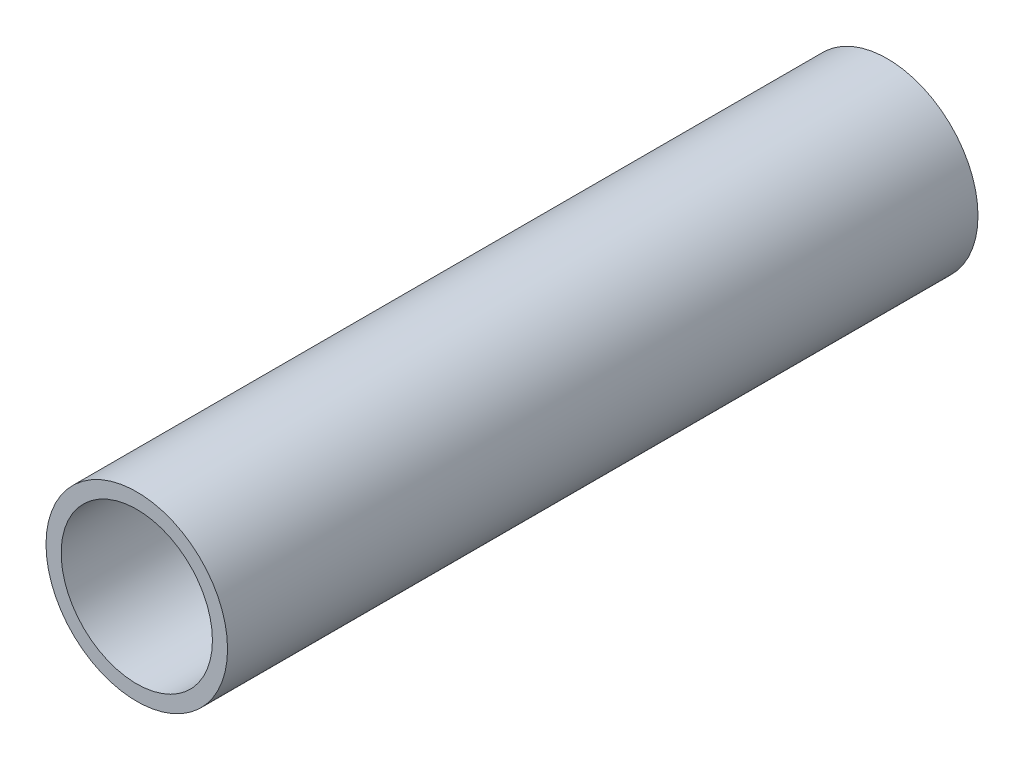
ISO-10303-21;
HEADER;
FILE_DESCRIPTION(('STEP AP214'),'2;1');
FILE_NAME('part.step','',(''),(''),'','','');
FILE_SCHEMA(('AUTOMOTIVE_DESIGN { 1 0 10303 214 1 1 1 1 }'));
ENDSEC;
DATA;
#1=APPLICATION_CONTEXT('core data for automotive mechanical design processes');
#2=APPLICATION_PROTOCOL_DEFINITION('international standard','automotive_design',2000,#1);
#3=PRODUCT_CONTEXT('',#1,'mechanical');
#4=PRODUCT('Part','Part','',(#3));
#5=PRODUCT_RELATED_PRODUCT_CATEGORY('part','',(#4));
#6=PRODUCT_DEFINITION_FORMATION('','',#4);
#7=PRODUCT_DEFINITION_CONTEXT('part definition',#1,'design');
#8=PRODUCT_DEFINITION('design','',#6,#7);
#9=PRODUCT_DEFINITION_SHAPE('','',#8);
#10=(LENGTH_UNIT() NAMED_UNIT(*) SI_UNIT(.MILLI.,.METRE.));
#11=(NAMED_UNIT(*) PLANE_ANGLE_UNIT() SI_UNIT($,.RADIAN.));
#12=(NAMED_UNIT(*) SI_UNIT($,.STERADIAN.) SOLID_ANGLE_UNIT());
#13=UNCERTAINTY_MEASURE_WITH_UNIT(LENGTH_MEASURE(1.E-05),#10,'distance_accuracy_value','');
#14=(GEOMETRIC_REPRESENTATION_CONTEXT(3) GLOBAL_UNCERTAINTY_ASSIGNED_CONTEXT((#13)) GLOBAL_UNIT_ASSIGNED_CONTEXT((#10,
#11,#12)) REPRESENTATION_CONTEXT('',''));
#15=CARTESIAN_POINT('',(0.,0.,0.));
#16=DIRECTION('',(0.,0.,1.));
#17=DIRECTION('',(1.,0.,0.));
#18=AXIS2_PLACEMENT_3D('',#15,#16,#17);
#19=CARTESIAN_POINT('',(0.,0.,124.));
#20=DIRECTION('',(0.,0.,1.));
#21=DIRECTION('',(1.,0.,0.));
#22=AXIS2_PLACEMENT_3D('',#19,#20,#21);
#23=PLANE('',#22);
#24=CARTESIAN_POINT('',(0.,0.,124.));
#25=DIRECTION('',(0.,0.,1.));
#26=DIRECTION('',(1.,0.,0.));
#27=AXIS2_PLACEMENT_3D('',#24,#25,#26);
#28=CIRCLE('',#27,15.);
#29=CARTESIAN_POINT('',(15.,0.,124.));
#30=VERTEX_POINT('',#29);
#31=EDGE_CURVE('E10',#30,#30,#28,.T.);
#32=ORIENTED_EDGE('',*,*,#31,.T.);
#33=EDGE_LOOP('',(#32));
#34=FACE_BOUND('',#33,.T.);
#35=CARTESIAN_POINT('',(0.,0.,124.));
#36=DIRECTION('',(0.,0.,1.));
#37=DIRECTION('',(1.,0.,0.));
#38=AXIS2_PLACEMENT_3D('',#35,#36,#37);
#39=CIRCLE('',#38,12.5);
#40=CARTESIAN_POINT('',(12.5,0.,124.));
#41=VERTEX_POINT('',#40);
#42=EDGE_CURVE('E45',#41,#41,#39,.T.);
#43=ORIENTED_EDGE('',*,*,#42,.F.);
#44=EDGE_LOOP('',(#43));
#45=FACE_BOUND('',#44,.T.);
#46=ADVANCED_FACE('F34',(#34,#45),#23,.T.);
#47=CARTESIAN_POINT('',(0.,0.,0.));
#48=DIRECTION('',(0.,0.,1.));
#49=DIRECTION('',(1.,0.,0.));
#50=AXIS2_PLACEMENT_3D('',#47,#48,#49);
#51=PLANE('',#50);
#52=CARTESIAN_POINT('',(0.,0.,0.));
#53=DIRECTION('',(0.,0.,1.));
#54=DIRECTION('',(1.,0.,0.));
#55=AXIS2_PLACEMENT_3D('',#52,#53,#54);
#56=CIRCLE('',#55,15.);
#57=CARTESIAN_POINT('',(15.,0.,0.));
#58=VERTEX_POINT('',#57);
#59=EDGE_CURVE('E38',#58,#58,#56,.T.);
#60=ORIENTED_EDGE('',*,*,#59,.F.);
#61=EDGE_LOOP('',(#60));
#62=FACE_BOUND('',#61,.T.);
#63=CARTESIAN_POINT('',(0.,0.,0.));
#64=DIRECTION('',(0.,0.,1.));
#65=DIRECTION('',(1.,0.,0.));
#66=AXIS2_PLACEMENT_3D('',#63,#64,#65);
#67=CIRCLE('',#66,12.5);
#68=CARTESIAN_POINT('',(12.5,0.,0.));
#69=VERTEX_POINT('',#68);
#70=EDGE_CURVE('E47',#69,#69,#67,.T.);
#71=ORIENTED_EDGE('',*,*,#70,.T.);
#72=EDGE_LOOP('',(#71));
#73=FACE_BOUND('',#72,.T.);
#74=ADVANCED_FACE('F57',(#62,#73),#51,.F.);
#75=CARTESIAN_POINT('',(0.,0.,124.));
#76=DIRECTION('',(0.,0.,-1.));
#77=DIRECTION('',(-1.,0.,0.));
#78=AXIS2_PLACEMENT_3D('',#75,#76,#77);
#79=CYLINDRICAL_SURFACE('',#78,15.);
#80=ORIENTED_EDGE('',*,*,#31,.F.);
#81=EDGE_LOOP('',(#80));
#82=FACE_BOUND('',#81,.T.);
#83=ORIENTED_EDGE('',*,*,#59,.T.);
#84=EDGE_LOOP('',(#83));
#85=FACE_BOUND('',#84,.T.);
#86=ADVANCED_FACE('F36',(#82,#85),#79,.T.);
#87=CARTESIAN_POINT('',(0.,0.,124.));
#88=DIRECTION('',(0.,0.,-1.));
#89=DIRECTION('',(-1.,0.,0.));
#90=AXIS2_PLACEMENT_3D('',#87,#88,#89);
#91=CYLINDRICAL_SURFACE('',#90,12.5);
#92=ORIENTED_EDGE('',*,*,#42,.T.);
#93=EDGE_LOOP('',(#92));
#94=FACE_BOUND('',#93,.T.);
#95=ORIENTED_EDGE('',*,*,#70,.F.);
#96=EDGE_LOOP('',(#95));
#97=FACE_BOUND('',#96,.T.);
#98=ADVANCED_FACE('F53',(#94,#97),#91,.F.);
#99=CLOSED_SHELL('',(#46,#74,#86,#98));
#100=MANIFOLD_SOLID_BREP('B2',#99);
#101=ADVANCED_BREP_SHAPE_REPRESENTATION('',(#18,#100),#14);
#102=SHAPE_DEFINITION_REPRESENTATION(#9,#101);
ENDSEC;
END-ISO-10303-21;
